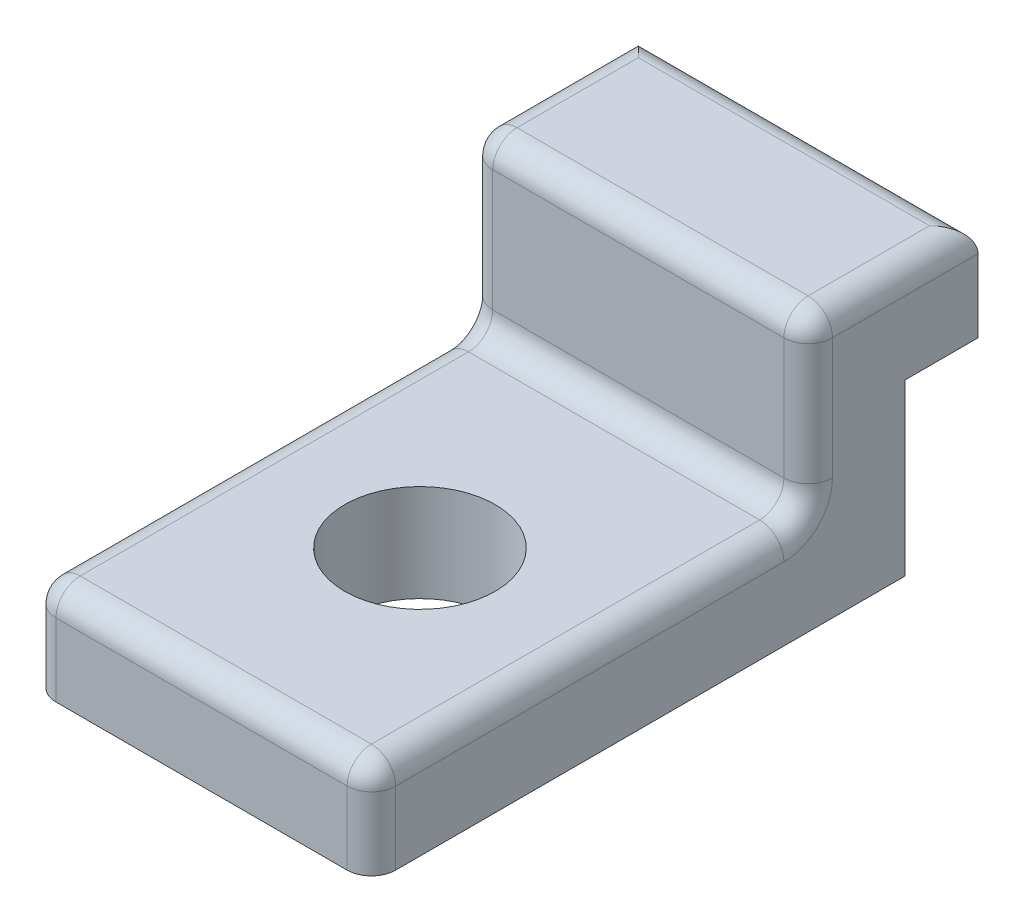
ISO-10303-21;
HEADER;
FILE_DESCRIPTION(('STEP AP214'),'2;1');
FILE_NAME('part.step','',(''),(''),'','','');
FILE_SCHEMA(('AUTOMOTIVE_DESIGN { 1 0 10303 214 1 1 1 1 }'));
ENDSEC;
DATA;
#1=APPLICATION_CONTEXT('core data for automotive mechanical design processes');
#2=APPLICATION_PROTOCOL_DEFINITION('international standard','automotive_design',2000,#1);
#3=PRODUCT_CONTEXT('',#1,'mechanical');
#4=PRODUCT('Part','Part','',(#3));
#5=PRODUCT_RELATED_PRODUCT_CATEGORY('part','',(#4));
#6=PRODUCT_DEFINITION_FORMATION('','',#4);
#7=PRODUCT_DEFINITION_CONTEXT('part definition',#1,'design');
#8=PRODUCT_DEFINITION('design','',#6,#7);
#9=PRODUCT_DEFINITION_SHAPE('','',#8);
#10=(LENGTH_UNIT() NAMED_UNIT(*) SI_UNIT(.MILLI.,.METRE.));
#11=(NAMED_UNIT(*) PLANE_ANGLE_UNIT() SI_UNIT($,.RADIAN.));
#12=(NAMED_UNIT(*) SI_UNIT($,.STERADIAN.) SOLID_ANGLE_UNIT());
#13=UNCERTAINTY_MEASURE_WITH_UNIT(LENGTH_MEASURE(1.E-05),#10,'distance_accuracy_value','');
#14=(GEOMETRIC_REPRESENTATION_CONTEXT(3) GLOBAL_UNCERTAINTY_ASSIGNED_CONTEXT((#13)) GLOBAL_UNIT_ASSIGNED_CONTEXT((#10,
#11,#12)) REPRESENTATION_CONTEXT('',''));
#15=CARTESIAN_POINT('',(0.,0.,0.));
#16=DIRECTION('',(0.,0.,1.));
#17=DIRECTION('',(1.,0.,0.));
#18=AXIS2_PLACEMENT_3D('',#15,#16,#17);
#19=CARTESIAN_POINT('',(-3.5,2.,-5.5));
#20=DIRECTION('',(0.,0.,1.));
#21=DIRECTION('',(1.,0.,0.));
#22=AXIS2_PLACEMENT_3D('',#19,#20,#21);
#23=PLANE('',#22);
#24=DIRECTION('',(-1.,0.,0.));
#25=VECTOR('',#24,1.);
#26=CARTESIAN_POINT('',(3.5,3.5,-5.5));
#27=LINE('',#26,#25);
#28=CARTESIAN_POINT('',(3.5,3.5,-5.5));
#29=VERTEX_POINT('',#28);
#30=CARTESIAN_POINT('',(-3.5,3.5,-5.5));
#31=VERTEX_POINT('',#30);
#32=EDGE_CURVE('E172',#29,#31,#27,.T.);
#33=ORIENTED_EDGE('',*,*,#32,.F.);
#34=DIRECTION('',(0.,-1.,0.));
#35=VECTOR('',#34,1.);
#36=CARTESIAN_POINT('',(3.5,2.,-5.5));
#37=LINE('',#36,#35);
#38=CARTESIAN_POINT('',(3.5,0.,-5.5));
#39=VERTEX_POINT('',#38);
#40=EDGE_CURVE('E187',#29,#39,#37,.T.);
#41=ORIENTED_EDGE('',*,*,#40,.T.);
#42=DIRECTION('',(-1.,0.,0.));
#43=VECTOR('',#42,1.);
#44=CARTESIAN_POINT('',(-3.5,0.,-5.5));
#45=LINE('',#44,#43);
#46=CARTESIAN_POINT('',(-3.5,0.,-5.5));
#47=VERTEX_POINT('',#46);
#48=EDGE_CURVE('E190',#39,#47,#45,.T.);
#49=ORIENTED_EDGE('',*,*,#48,.T.);
#50=DIRECTION('',(0.,-1.,0.));
#51=VECTOR('',#50,1.);
#52=CARTESIAN_POINT('',(-3.5,2.,-5.5));
#53=LINE('',#52,#51);
#54=EDGE_CURVE('E203',#31,#47,#53,.T.);
#55=ORIENTED_EDGE('',*,*,#54,.F.);
#56=EDGE_LOOP('',(#33,#41,#49,#55));
#57=FACE_BOUND('',#56,.T.);
#58=ADVANCED_FACE('F39',(#57),#23,.F.);
#59=CARTESIAN_POINT('',(3.5,2.,-5.5));
#60=DIRECTION('',(-1.,0.,0.));
#61=DIRECTION('',(0.,0.,1.));
#62=AXIS2_PLACEMENT_3D('',#59,#60,#61);
#63=PLANE('',#62);
#64=DIRECTION('',(0.,-1.,0.));
#65=VECTOR('',#64,1.);
#66=CARTESIAN_POINT('',(3.5,5.5,-7.));
#67=LINE('',#66,#65);
#68=CARTESIAN_POINT('',(3.5,5.,-7.));
#69=VERTEX_POINT('',#68);
#70=CARTESIAN_POINT('',(3.5,3.5,-7.));
#71=VERTEX_POINT('',#70);
#72=EDGE_CURVE('E161',#69,#71,#67,.T.);
#73=ORIENTED_EDGE('',*,*,#72,.F.);
#74=DIRECTION('',(0.,0.,-1.));
#75=VECTOR('',#74,1.);
#76=CARTESIAN_POINT('',(3.5,5.,-3.5));
#77=LINE('',#76,#75);
#78=CARTESIAN_POINT('',(3.5,5.,-4.));
#79=VERTEX_POINT('',#78);
#80=EDGE_CURVE('E235',#69,#79,#77,.F.);
#81=ORIENTED_EDGE('',*,*,#80,.T.);
#82=DIRECTION('',(0.,-1.,0.));
#83=VECTOR('',#82,1.);
#84=CARTESIAN_POINT('',(3.5,2.,-4.));
#85=LINE('',#84,#83);
#86=CARTESIAN_POINT('',(3.5,2.5,-4.));
#87=VERTEX_POINT('',#86);
#88=EDGE_CURVE('E233',#79,#87,#85,.T.);
#89=ORIENTED_EDGE('',*,*,#88,.T.);
#90=CARTESIAN_POINT('',(3.5,2.5,-3.));
#91=DIRECTION('',(-1.,0.,0.));
#92=DIRECTION('',(0.,0.,1.));
#93=AXIS2_PLACEMENT_3D('',#90,#91,#92);
#94=CIRCLE('',#93,1.);
#95=CARTESIAN_POINT('',(3.5,1.5,-3.));
#96=VERTEX_POINT('',#95);
#97=EDGE_CURVE('E230',#96,#87,#94,.F.);
#98=ORIENTED_EDGE('',*,*,#97,.F.);
#99=DIRECTION('',(0.,0.,-1.));
#100=VECTOR('',#99,1.);
#101=CARTESIAN_POINT('',(3.5,1.5,5.5));
#102=LINE('',#101,#100);
#103=CARTESIAN_POINT('',(3.5,1.5,5.));
#104=VERTEX_POINT('',#103);
#105=EDGE_CURVE('E226',#96,#104,#102,.F.);
#106=ORIENTED_EDGE('',*,*,#105,.T.);
#107=DIRECTION('',(0.,-1.,0.));
#108=VECTOR('',#107,1.);
#109=CARTESIAN_POINT('',(3.5,2.,5.));
#110=LINE('',#109,#108);
#111=CARTESIAN_POINT('',(3.5,0.,5.));
#112=VERTEX_POINT('',#111);
#113=EDGE_CURVE('E228',#104,#112,#110,.T.);
#114=ORIENTED_EDGE('',*,*,#113,.T.);
#115=DIRECTION('',(0.,0.,-1.));
#116=VECTOR('',#115,1.);
#117=CARTESIAN_POINT('',(3.5,0.,-5.5));
#118=LINE('',#117,#116);
#119=EDGE_CURVE('E188',#112,#39,#118,.T.);
#120=ORIENTED_EDGE('',*,*,#119,.T.);
#121=ORIENTED_EDGE('',*,*,#40,.F.);
#122=DIRECTION('',(0.,0.,1.));
#123=VECTOR('',#122,1.);
#124=CARTESIAN_POINT('',(3.5,3.5,-7.));
#125=LINE('',#124,#123);
#126=EDGE_CURVE('E178',#71,#29,#125,.T.);
#127=ORIENTED_EDGE('',*,*,#126,.F.);
#128=EDGE_LOOP('',(#73,#81,#89,#98,#106,#114,#120,#121,#127));
#129=FACE_BOUND('',#128,.T.);
#130=ADVANCED_FACE('F185',(#129),#63,.F.);
#131=CARTESIAN_POINT('',(-3.5,2.,-5.5));
#132=DIRECTION('',(1.,0.,0.));
#133=DIRECTION('',(0.,0.,-1.));
#134=AXIS2_PLACEMENT_3D('',#131,#132,#133);
#135=PLANE('',#134);
#136=DIRECTION('',(0.,-1.,0.));
#137=VECTOR('',#136,1.);
#138=CARTESIAN_POINT('',(-3.5,2.,-4.));
#139=LINE('',#138,#137);
#140=CARTESIAN_POINT('',(-3.5,2.5,-4.));
#141=VERTEX_POINT('',#140);
#142=CARTESIAN_POINT('',(-3.5,5.,-4.));
#143=VERTEX_POINT('',#142);
#144=EDGE_CURVE('E221',#141,#143,#139,.F.);
#145=ORIENTED_EDGE('',*,*,#144,.T.);
#146=DIRECTION('',(0.,0.,1.));
#147=VECTOR('',#146,1.);
#148=CARTESIAN_POINT('',(-3.5,5.,-7.));
#149=LINE('',#148,#147);
#150=CARTESIAN_POINT('',(-3.5,5.,-7.));
#151=VERTEX_POINT('',#150);
#152=EDGE_CURVE('E224',#143,#151,#149,.F.);
#153=ORIENTED_EDGE('',*,*,#152,.T.);
#154=DIRECTION('',(0.,1.,0.));
#155=VECTOR('',#154,1.);
#156=CARTESIAN_POINT('',(-3.5,5.5,-7.));
#157=LINE('',#156,#155);
#158=CARTESIAN_POINT('',(-3.5,3.5,-7.));
#159=VERTEX_POINT('',#158);
#160=EDGE_CURVE('E182',#159,#151,#157,.T.);
#161=ORIENTED_EDGE('',*,*,#160,.F.);
#162=DIRECTION('',(0.,0.,1.));
#163=VECTOR('',#162,1.);
#164=CARTESIAN_POINT('',(-3.5,3.5,-7.));
#165=LINE('',#164,#163);
#166=EDGE_CURVE('E180',#159,#31,#165,.T.);
#167=ORIENTED_EDGE('',*,*,#166,.T.);
#168=ORIENTED_EDGE('',*,*,#54,.T.);
#169=DIRECTION('',(0.,0.,1.));
#170=VECTOR('',#169,1.);
#171=CARTESIAN_POINT('',(-3.5,0.,-5.5));
#172=LINE('',#171,#170);
#173=CARTESIAN_POINT('',(-3.5,0.,5.));
#174=VERTEX_POINT('',#173);
#175=EDGE_CURVE('E197',#47,#174,#172,.T.);
#176=ORIENTED_EDGE('',*,*,#175,.T.);
#177=DIRECTION('',(0.,-1.,0.));
#178=VECTOR('',#177,1.);
#179=CARTESIAN_POINT('',(-3.5,2.,5.));
#180=LINE('',#179,#178);
#181=CARTESIAN_POINT('',(-3.5,1.5,5.));
#182=VERTEX_POINT('',#181);
#183=EDGE_CURVE('E219',#174,#182,#180,.F.);
#184=ORIENTED_EDGE('',*,*,#183,.T.);
#185=DIRECTION('',(0.,0.,1.));
#186=VECTOR('',#185,1.);
#187=CARTESIAN_POINT('',(-3.5,1.5,-3.5));
#188=LINE('',#187,#186);
#189=CARTESIAN_POINT('',(-3.5,1.5,-3.));
#190=VERTEX_POINT('',#189);
#191=EDGE_CURVE('E217',#182,#190,#188,.F.);
#192=ORIENTED_EDGE('',*,*,#191,.T.);
#193=CARTESIAN_POINT('',(-3.5,2.5,-3.));
#194=DIRECTION('',(1.,0.,0.));
#195=DIRECTION('',(0.,0.,-1.));
#196=AXIS2_PLACEMENT_3D('',#193,#194,#195);
#197=CIRCLE('',#196,1.);
#198=EDGE_CURVE('E215',#141,#190,#197,.F.);
#199=ORIENTED_EDGE('',*,*,#198,.F.);
#200=EDGE_LOOP('',(#145,#153,#161,#167,#168,#176,#184,#192,#199));
#201=FACE_BOUND('',#200,.T.);
#202=ADVANCED_FACE('F329',(#201),#135,.F.);
#203=CARTESIAN_POINT('',(-3.5,2.,5.5));
#204=DIRECTION('',(0.,0.,-1.));
#205=DIRECTION('',(-1.,0.,0.));
#206=AXIS2_PLACEMENT_3D('',#203,#204,#205);
#207=PLANE('',#206);
#208=DIRECTION('',(1.,0.,0.));
#209=VECTOR('',#208,1.);
#210=CARTESIAN_POINT('',(-3.5,0.,5.5));
#211=LINE('',#210,#209);
#212=CARTESIAN_POINT('',(-3.,0.,5.5));
#213=VERTEX_POINT('',#212);
#214=CARTESIAN_POINT('',(3.,0.,5.5));
#215=VERTEX_POINT('',#214);
#216=EDGE_CURVE('E200',#213,#215,#211,.T.);
#217=ORIENTED_EDGE('',*,*,#216,.T.);
#218=DIRECTION('',(0.,-1.,0.));
#219=VECTOR('',#218,1.);
#220=CARTESIAN_POINT('',(3.,2.,5.5));
#221=LINE('',#220,#219);
#222=CARTESIAN_POINT('',(3.,1.5,5.5));
#223=VERTEX_POINT('',#222);
#224=EDGE_CURVE('E245',#215,#223,#221,.F.);
#225=ORIENTED_EDGE('',*,*,#224,.T.);
#226=DIRECTION('',(1.,0.,0.));
#227=VECTOR('',#226,1.);
#228=CARTESIAN_POINT('',(-3.5,1.5,5.5));
#229=LINE('',#228,#227);
#230=CARTESIAN_POINT('',(-3.,1.5,5.5));
#231=VERTEX_POINT('',#230);
#232=EDGE_CURVE('E241',#223,#231,#229,.F.);
#233=ORIENTED_EDGE('',*,*,#232,.T.);
#234=DIRECTION('',(0.,-1.,0.));
#235=VECTOR('',#234,1.);
#236=CARTESIAN_POINT('',(-3.,2.,5.5));
#237=LINE('',#236,#235);
#238=EDGE_CURVE('E243',#231,#213,#237,.T.);
#239=ORIENTED_EDGE('',*,*,#238,.T.);
#240=EDGE_LOOP('',(#217,#225,#233,#239));
#241=FACE_BOUND('',#240,.T.);
#242=ADVANCED_FACE('F393',(#241),#207,.F.);
#243=CARTESIAN_POINT('',(0.,2.,0.));
#244=DIRECTION('',(0.,1.,0.));
#245=DIRECTION('',(0.,0.,1.));
#246=AXIS2_PLACEMENT_3D('',#243,#244,#245);
#247=PLANE('',#246);
#248=DIRECTION('',(0.,0.,-1.));
#249=VECTOR('',#248,1.);
#250=CARTESIAN_POINT('',(3.,2.,-3.5));
#251=LINE('',#250,#249);
#252=CARTESIAN_POINT('',(3.,2.,5.));
#253=VERTEX_POINT('',#252);
#254=CARTESIAN_POINT('',(3.,2.,-3.));
#255=VERTEX_POINT('',#254);
#256=EDGE_CURVE('E63',#253,#255,#251,.T.);
#257=ORIENTED_EDGE('',*,*,#256,.T.);
#258=DIRECTION('',(1.,0.,0.));
#259=VECTOR('',#258,1.);
#260=CARTESIAN_POINT('',(0.,2.,-3.));
#261=LINE('',#260,#259);
#262=CARTESIAN_POINT('',(-3.,2.,-3.));
#263=VERTEX_POINT('',#262);
#264=EDGE_CURVE('E11',#255,#263,#261,.F.);
#265=ORIENTED_EDGE('',*,*,#264,.T.);
#266=DIRECTION('',(0.,0.,1.));
#267=VECTOR('',#266,1.);
#268=CARTESIAN_POINT('',(-3.,2.,5.5));
#269=LINE('',#268,#267);
#270=CARTESIAN_POINT('',(-3.,2.,5.));
#271=VERTEX_POINT('',#270);
#272=EDGE_CURVE('E48',#263,#271,#269,.T.);
#273=ORIENTED_EDGE('',*,*,#272,.T.);
#274=DIRECTION('',(1.,0.,0.));
#275=VECTOR('',#274,1.);
#276=CARTESIAN_POINT('',(3.5,2.,5.));
#277=LINE('',#276,#275);
#278=EDGE_CURVE('E257',#271,#253,#277,.T.);
#279=ORIENTED_EDGE('',*,*,#278,.T.);
#280=EDGE_LOOP('',(#257,#265,#273,#279));
#281=FACE_BOUND('',#280,.T.);
#282=CARTESIAN_POINT('',(0.,2.,1.));
#283=DIRECTION('',(0.,1.,0.));
#284=DIRECTION('',(0.,0.,1.));
#285=AXIS2_PLACEMENT_3D('',#282,#283,#284);
#286=CIRCLE('',#285,1.55);
#287=CARTESIAN_POINT('',(0.,2.,2.55));
#288=VERTEX_POINT('',#287);
#289=EDGE_CURVE('E315',#288,#288,#286,.T.);
#290=ORIENTED_EDGE('',*,*,#289,.F.);
#291=EDGE_LOOP('',(#290));
#292=FACE_BOUND('',#291,.T.);
#293=ADVANCED_FACE('F370',(#281,#292),#247,.T.);
#294=CARTESIAN_POINT('',(0.,0.,0.));
#295=DIRECTION('',(0.,1.,0.));
#296=DIRECTION('',(0.,0.,1.));
#297=AXIS2_PLACEMENT_3D('',#294,#295,#296);
#298=PLANE('',#297);
#299=CARTESIAN_POINT('',(0.,0.,1.));
#300=DIRECTION('',(0.,1.,0.));
#301=DIRECTION('',(0.,0.,1.));
#302=AXIS2_PLACEMENT_3D('',#299,#300,#301);
#303=CIRCLE('',#302,1.55);
#304=CARTESIAN_POINT('',(0.,0.,2.55));
#305=VERTEX_POINT('',#304);
#306=EDGE_CURVE('E320',#305,#305,#303,.T.);
#307=ORIENTED_EDGE('',*,*,#306,.T.);
#308=EDGE_LOOP('',(#307));
#309=FACE_BOUND('',#308,.T.);
#310=ORIENTED_EDGE('',*,*,#119,.F.);
#311=CARTESIAN_POINT('',(3.,0.,5.));
#312=DIRECTION('',(0.,1.,0.));
#313=DIRECTION('',(0.,0.,1.));
#314=AXIS2_PLACEMENT_3D('',#311,#312,#313);
#315=CIRCLE('',#314,0.5);
#316=EDGE_CURVE('E239',#112,#215,#315,.F.);
#317=ORIENTED_EDGE('',*,*,#316,.T.);
#318=ORIENTED_EDGE('',*,*,#216,.F.);
#319=CARTESIAN_POINT('',(-3.,0.,5.));
#320=DIRECTION('',(0.,1.,0.));
#321=DIRECTION('',(0.,0.,1.));
#322=AXIS2_PLACEMENT_3D('',#319,#320,#321);
#323=CIRCLE('',#322,0.5);
#324=EDGE_CURVE('E237',#213,#174,#323,.F.);
#325=ORIENTED_EDGE('',*,*,#324,.T.);
#326=ORIENTED_EDGE('',*,*,#175,.F.);
#327=ORIENTED_EDGE('',*,*,#48,.F.);
#328=EDGE_LOOP('',(#310,#317,#318,#325,#326,#327));
#329=FACE_BOUND('',#328,.T.);
#330=ADVANCED_FACE('F397',(#309,#329),#298,.F.);
#331=CARTESIAN_POINT('',(-3.5,5.5,-3.5));
#332=DIRECTION('',(0.,0.,-1.));
#333=DIRECTION('',(-1.,0.,0.));
#334=AXIS2_PLACEMENT_3D('',#331,#332,#333);
#335=PLANE('',#334);
#336=DIRECTION('',(0.,-1.,0.));
#337=VECTOR('',#336,1.);
#338=CARTESIAN_POINT('',(3.,5.5,-3.5));
#339=LINE('',#338,#337);
#340=CARTESIAN_POINT('',(3.,2.5,-3.5));
#341=VERTEX_POINT('',#340);
#342=CARTESIAN_POINT('',(3.,5.,-3.5));
#343=VERTEX_POINT('',#342);
#344=EDGE_CURVE('E208',#341,#343,#339,.F.);
#345=ORIENTED_EDGE('',*,*,#344,.T.);
#346=DIRECTION('',(1.,0.,0.));
#347=VECTOR('',#346,1.);
#348=CARTESIAN_POINT('',(-3.5,5.,-3.5));
#349=LINE('',#348,#347);
#350=CARTESIAN_POINT('',(-3.,5.,-3.5));
#351=VERTEX_POINT('',#350);
#352=EDGE_CURVE('E213',#343,#351,#349,.F.);
#353=ORIENTED_EDGE('',*,*,#352,.T.);
#354=DIRECTION('',(0.,-1.,0.));
#355=VECTOR('',#354,1.);
#356=CARTESIAN_POINT('',(-3.,5.5,-3.5));
#357=LINE('',#356,#355);
#358=CARTESIAN_POINT('',(-3.,2.5,-3.5));
#359=VERTEX_POINT('',#358);
#360=EDGE_CURVE('E210',#351,#359,#357,.T.);
#361=ORIENTED_EDGE('',*,*,#360,.T.);
#362=DIRECTION('',(1.,0.,0.));
#363=VECTOR('',#362,1.);
#364=CARTESIAN_POINT('',(-3.5,2.5,-3.5));
#365=LINE('',#364,#363);
#366=EDGE_CURVE('E206',#359,#341,#365,.T.);
#367=ORIENTED_EDGE('',*,*,#366,.T.);
#368=EDGE_LOOP('',(#345,#353,#361,#367));
#369=FACE_BOUND('',#368,.T.);
#370=ADVANCED_FACE('F591',(#369),#335,.F.);
#371=CARTESIAN_POINT('',(0.,5.5,0.));
#372=DIRECTION('',(0.,1.,0.));
#373=DIRECTION('',(0.,0.,1.));
#374=AXIS2_PLACEMENT_3D('',#371,#372,#373);
#375=PLANE('',#374);
#376=DIRECTION('',(0.,0.,-1.));
#377=VECTOR('',#376,1.);
#378=CARTESIAN_POINT('',(3.,5.5,-7.));
#379=LINE('',#378,#377);
#380=CARTESIAN_POINT('',(3.,5.5,-4.));
#381=VERTEX_POINT('',#380);
#382=CARTESIAN_POINT('',(3.,5.5,-6.5));
#383=VERTEX_POINT('',#382);
#384=EDGE_CURVE('E252',#381,#383,#379,.T.);
#385=ORIENTED_EDGE('',*,*,#384,.T.);
#386=DIRECTION('',(1.,0.,0.));
#387=VECTOR('',#386,1.);
#388=CARTESIAN_POINT('',(0.,5.5,-6.5));
#389=LINE('',#388,#387);
#390=CARTESIAN_POINT('',(-3.,5.5,-6.5));
#391=VERTEX_POINT('',#390);
#392=EDGE_CURVE('E254',#383,#391,#389,.F.);
#393=ORIENTED_EDGE('',*,*,#392,.T.);
#394=DIRECTION('',(0.,0.,1.));
#395=VECTOR('',#394,1.);
#396=CARTESIAN_POINT('',(-3.,5.5,-3.5));
#397=LINE('',#396,#395);
#398=CARTESIAN_POINT('',(-3.,5.5,-4.));
#399=VERTEX_POINT('',#398);
#400=EDGE_CURVE('E250',#391,#399,#397,.T.);
#401=ORIENTED_EDGE('',*,*,#400,.T.);
#402=DIRECTION('',(1.,0.,0.));
#403=VECTOR('',#402,1.);
#404=CARTESIAN_POINT('',(3.5,5.5,-4.));
#405=LINE('',#404,#403);
#406=EDGE_CURVE('E248',#399,#381,#405,.T.);
#407=ORIENTED_EDGE('',*,*,#406,.T.);
#408=EDGE_LOOP('',(#385,#393,#401,#407));
#409=FACE_BOUND('',#408,.T.);
#410=ADVANCED_FACE('F341',(#409),#375,.T.);
#411=CARTESIAN_POINT('',(3.5,3.5,-7.));
#412=DIRECTION('',(0.,1.,0.));
#413=DIRECTION('',(0.,0.,1.));
#414=AXIS2_PLACEMENT_3D('',#411,#412,#413);
#415=PLANE('',#414);
#416=ORIENTED_EDGE('',*,*,#32,.T.);
#417=ORIENTED_EDGE('',*,*,#166,.F.);
#418=DIRECTION('',(-1.,0.,0.));
#419=VECTOR('',#418,1.);
#420=CARTESIAN_POINT('',(3.5,3.5,-7.));
#421=LINE('',#420,#419);
#422=EDGE_CURVE('E165',#71,#159,#421,.T.);
#423=ORIENTED_EDGE('',*,*,#422,.F.);
#424=ORIENTED_EDGE('',*,*,#126,.T.);
#425=EDGE_LOOP('',(#416,#417,#423,#424));
#426=FACE_BOUND('',#425,.T.);
#427=ADVANCED_FACE('F177',(#426),#415,.F.);
#428=CARTESIAN_POINT('',(0.,0.,-7.));
#429=DIRECTION('',(0.,0.,-1.));
#430=DIRECTION('',(-1.,0.,0.));
#431=AXIS2_PLACEMENT_3D('',#428,#429,#430);
#432=PLANE('',#431);
#433=ORIENTED_EDGE('',*,*,#160,.T.);
#434=DIRECTION('',(1.,0.,0.));
#435=VECTOR('',#434,1.);
#436=CARTESIAN_POINT('',(0.,5.,-7.));
#437=LINE('',#436,#435);
#438=EDGE_CURVE('E168',#151,#69,#437,.T.);
#439=ORIENTED_EDGE('',*,*,#438,.T.);
#440=ORIENTED_EDGE('',*,*,#72,.T.);
#441=ORIENTED_EDGE('',*,*,#422,.T.);
#442=EDGE_LOOP('',(#433,#439,#440,#441));
#443=FACE_BOUND('',#442,.T.);
#444=ADVANCED_FACE('F164',(#443),#432,.T.);
#445=CARTESIAN_POINT('',(0.,0.,1.));
#446=DIRECTION('',(0.,1.,0.));
#447=DIRECTION('',(0.,0.,1.));
#448=AXIS2_PLACEMENT_3D('',#445,#446,#447);
#449=CYLINDRICAL_SURFACE('',#448,1.55);
#450=ORIENTED_EDGE('',*,*,#306,.F.);
#451=EDGE_LOOP('',(#450));
#452=FACE_BOUND('',#451,.T.);
#453=ORIENTED_EDGE('',*,*,#289,.T.);
#454=EDGE_LOOP('',(#453));
#455=FACE_BOUND('',#454,.T.);
#456=ADVANCED_FACE('F408',(#452,#455),#449,.F.);
#457=CARTESIAN_POINT('',(3.,2.,5.));
#458=DIRECTION('',(0.,-1.,0.));
#459=DIRECTION('',(0.,0.,-1.));
#460=AXIS2_PLACEMENT_3D('',#457,#458,#459);
#461=CYLINDRICAL_SURFACE('',#460,0.5);
#462=CARTESIAN_POINT('',(3.,1.5,5.));
#463=DIRECTION('',(0.,1.,0.));
#464=DIRECTION('',(0.,0.,1.));
#465=AXIS2_PLACEMENT_3D('',#462,#463,#464);
#466=CIRCLE('',#465,0.5);
#467=EDGE_CURVE('E43',#223,#104,#466,.T.);
#468=ORIENTED_EDGE('',*,*,#467,.F.);
#469=ORIENTED_EDGE('',*,*,#224,.F.);
#470=ORIENTED_EDGE('',*,*,#316,.F.);
#471=ORIENTED_EDGE('',*,*,#113,.F.);
#472=EDGE_LOOP('',(#468,#469,#470,#471));
#473=FACE_BOUND('',#472,.T.);
#474=ADVANCED_FACE('F41',(#473),#461,.T.);
#475=CARTESIAN_POINT('',(3.,1.5,5.));
#476=DIRECTION('',(1.,0.,0.));
#477=DIRECTION('',(0.,0.,-1.));
#478=AXIS2_PLACEMENT_3D('',#475,#476,#477);
#479=SPHERICAL_SURFACE('',#478,0.5);
#480=CARTESIAN_POINT('',(3.,1.5,5.));
#481=DIRECTION('',(1.,0.,0.));
#482=DIRECTION('',(0.,0.,-1.));
#483=AXIS2_PLACEMENT_3D('',#480,#481,#482);
#484=CIRCLE('',#483,0.5);
#485=EDGE_CURVE('E307',#223,#253,#484,.F.);
#486=ORIENTED_EDGE('',*,*,#485,.F.);
#487=ORIENTED_EDGE('',*,*,#467,.T.);
#488=CARTESIAN_POINT('',(3.,1.5,5.));
#489=DIRECTION('',(0.,0.,1.));
#490=DIRECTION('',(0.,-1.,0.));
#491=AXIS2_PLACEMENT_3D('',#488,#489,#490);
#492=CIRCLE('',#491,0.5);
#493=EDGE_CURVE('E309',#253,#104,#492,.F.);
#494=ORIENTED_EDGE('',*,*,#493,.F.);
#495=EDGE_LOOP('',(#486,#487,#494));
#496=FACE_BOUND('',#495,.T.);
#497=ADVANCED_FACE('F401',(#496),#479,.T.);
#498=CARTESIAN_POINT('',(3.,5.,0.));
#499=DIRECTION('',(0.,0.,1.));
#500=DIRECTION('',(1.,0.,0.));
#501=AXIS2_PLACEMENT_3D('',#498,#499,#500);
#502=CYLINDRICAL_SURFACE('',#501,0.5);
#503=CARTESIAN_POINT('',(3.,5.,-4.));
#504=DIRECTION('',(0.,0.,1.));
#505=DIRECTION('',(1.,0.,0.));
#506=AXIS2_PLACEMENT_3D('',#503,#504,#505);
#507=CIRCLE('',#506,0.5);
#508=EDGE_CURVE('E301',#79,#381,#507,.T.);
#509=ORIENTED_EDGE('',*,*,#508,.F.);
#510=ORIENTED_EDGE('',*,*,#80,.F.);
#511=CARTESIAN_POINT('',(3.,5.,-6.5));
#512=DIRECTION('',(0.707106781186547,0.,0.707106781186548));
#513=DIRECTION('',(-0.707106781186547,0.,0.707106781186547));
#514=AXIS2_PLACEMENT_3D('',#511,#512,#513);
#515=ELLIPSE('',#514,0.707106781186547,0.5);
#516=EDGE_CURVE('E304',#383,#69,#515,.F.);
#517=ORIENTED_EDGE('',*,*,#516,.F.);
#518=ORIENTED_EDGE('',*,*,#384,.F.);
#519=EDGE_LOOP('',(#509,#510,#517,#518));
#520=FACE_BOUND('',#519,.T.);
#521=ADVANCED_FACE('F354',(#520),#502,.T.);
#522=CARTESIAN_POINT('',(3.,2.,-4.));
#523=DIRECTION('',(0.,-1.,0.));
#524=DIRECTION('',(0.,0.,-1.));
#525=AXIS2_PLACEMENT_3D('',#522,#523,#524);
#526=CYLINDRICAL_SURFACE('',#525,0.5);
#527=CARTESIAN_POINT('',(3.,2.5,-4.));
#528=DIRECTION('',(0.,-1.,0.));
#529=DIRECTION('',(0.,0.,-1.));
#530=AXIS2_PLACEMENT_3D('',#527,#528,#529);
#531=CIRCLE('',#530,0.5);
#532=EDGE_CURVE('E295',#87,#341,#531,.T.);
#533=ORIENTED_EDGE('',*,*,#532,.F.);
#534=ORIENTED_EDGE('',*,*,#88,.F.);
#535=CARTESIAN_POINT('',(3.,5.,-4.));
#536=DIRECTION('',(0.,1.,0.));
#537=DIRECTION('',(0.,0.,1.));
#538=AXIS2_PLACEMENT_3D('',#535,#536,#537);
#539=CIRCLE('',#538,0.5);
#540=EDGE_CURVE('E298',#343,#79,#539,.T.);
#541=ORIENTED_EDGE('',*,*,#540,.F.);
#542=ORIENTED_EDGE('',*,*,#344,.F.);
#543=EDGE_LOOP('',(#533,#534,#541,#542));
#544=FACE_BOUND('',#543,.T.);
#545=ADVANCED_FACE('F358',(#544),#526,.T.);
#546=CARTESIAN_POINT('',(3.,1.5,0.));
#547=DIRECTION('',(0.,0.,1.));
#548=DIRECTION('',(1.,0.,0.));
#549=AXIS2_PLACEMENT_3D('',#546,#547,#548);
#550=CYLINDRICAL_SURFACE('',#549,0.5);
#551=ORIENTED_EDGE('',*,*,#493,.T.);
#552=ORIENTED_EDGE('',*,*,#105,.F.);
#553=CARTESIAN_POINT('',(3.,1.5,-3.));
#554=DIRECTION('',(0.,0.,-1.));
#555=DIRECTION('',(-1.,0.,0.));
#556=AXIS2_PLACEMENT_3D('',#553,#554,#555);
#557=CIRCLE('',#556,0.5);
#558=EDGE_CURVE('E292',#255,#96,#557,.T.);
#559=ORIENTED_EDGE('',*,*,#558,.F.);
#560=ORIENTED_EDGE('',*,*,#256,.F.);
#561=EDGE_LOOP('',(#551,#552,#559,#560));
#562=FACE_BOUND('',#561,.T.);
#563=ADVANCED_FACE('F364',(#562),#550,.T.);
#564=CARTESIAN_POINT('',(0.,1.5,5.));
#565=DIRECTION('',(-1.,0.,0.));
#566=DIRECTION('',(0.,0.,1.));
#567=AXIS2_PLACEMENT_3D('',#564,#565,#566);
#568=CYLINDRICAL_SURFACE('',#567,0.5);
#569=ORIENTED_EDGE('',*,*,#485,.T.);
#570=ORIENTED_EDGE('',*,*,#278,.F.);
#571=CARTESIAN_POINT('',(-3.,1.5,5.));
#572=DIRECTION('',(-1.,0.,0.));
#573=DIRECTION('',(0.,-1.,0.));
#574=AXIS2_PLACEMENT_3D('',#571,#572,#573);
#575=CIRCLE('',#574,0.5);
#576=EDGE_CURVE('E289',#231,#271,#575,.T.);
#577=ORIENTED_EDGE('',*,*,#576,.F.);
#578=ORIENTED_EDGE('',*,*,#232,.F.);
#579=EDGE_LOOP('',(#569,#570,#577,#578));
#580=FACE_BOUND('',#579,.T.);
#581=ADVANCED_FACE('F376',(#580),#568,.T.);
#582=CARTESIAN_POINT('',(-3.,2.,5.));
#583=DIRECTION('',(0.,-1.,0.));
#584=DIRECTION('',(0.,0.,-1.));
#585=AXIS2_PLACEMENT_3D('',#582,#583,#584);
#586=CYLINDRICAL_SURFACE('',#585,0.5);
#587=ORIENTED_EDGE('',*,*,#324,.F.);
#588=ORIENTED_EDGE('',*,*,#238,.F.);
#589=CARTESIAN_POINT('',(-3.,1.5,5.));
#590=DIRECTION('',(0.,1.,0.));
#591=DIRECTION('',(0.,0.,1.));
#592=AXIS2_PLACEMENT_3D('',#589,#590,#591);
#593=CIRCLE('',#592,0.5);
#594=EDGE_CURVE('E286',#182,#231,#593,.T.);
#595=ORIENTED_EDGE('',*,*,#594,.F.);
#596=ORIENTED_EDGE('',*,*,#183,.F.);
#597=EDGE_LOOP('',(#587,#588,#595,#596));
#598=FACE_BOUND('',#597,.T.);
#599=ADVANCED_FACE('F390',(#598),#586,.T.);
#600=CARTESIAN_POINT('',(0.,5.,-6.5));
#601=DIRECTION('',(1.,0.,0.));
#602=DIRECTION('',(0.,0.,-1.));
#603=AXIS2_PLACEMENT_3D('',#600,#601,#602);
#604=CYLINDRICAL_SURFACE('',#603,0.5);
#605=ORIENTED_EDGE('',*,*,#516,.T.);
#606=ORIENTED_EDGE('',*,*,#438,.F.);
#607=CARTESIAN_POINT('',(-3.,5.,-6.5));
#608=DIRECTION('',(0.707106781186547,0.,-0.707106781186547));
#609=DIRECTION('',(-0.707106781186547,0.,-0.707106781186547));
#610=AXIS2_PLACEMENT_3D('',#607,#608,#609);
#611=ELLIPSE('',#610,0.707106781186548,0.5);
#612=EDGE_CURVE('E283',#391,#151,#611,.F.);
#613=ORIENTED_EDGE('',*,*,#612,.F.);
#614=ORIENTED_EDGE('',*,*,#392,.F.);
#615=EDGE_LOOP('',(#605,#606,#613,#614));
#616=FACE_BOUND('',#615,.T.);
#617=ADVANCED_FACE('F333',(#616),#604,.T.);
#618=CARTESIAN_POINT('',(3.,5.,-4.));
#619=DIRECTION('',(1.,0.,0.));
#620=DIRECTION('',(0.,0.,-1.));
#621=AXIS2_PLACEMENT_3D('',#618,#619,#620);
#622=SPHERICAL_SURFACE('',#621,0.5);
#623=ORIENTED_EDGE('',*,*,#540,.T.);
#624=ORIENTED_EDGE('',*,*,#508,.T.);
#625=CARTESIAN_POINT('',(3.,5.,-4.));
#626=DIRECTION('',(1.,0.,0.));
#627=DIRECTION('',(0.,0.,-1.));
#628=AXIS2_PLACEMENT_3D('',#625,#626,#627);
#629=CIRCLE('',#628,0.5);
#630=EDGE_CURVE('E280',#343,#381,#629,.F.);
#631=ORIENTED_EDGE('',*,*,#630,.F.);
#632=EDGE_LOOP('',(#623,#624,#631));
#633=FACE_BOUND('',#632,.T.);
#634=ADVANCED_FACE('F350',(#633),#622,.T.);
#635=CARTESIAN_POINT('',(3.,2.5,-3.));
#636=DIRECTION('',(-1.,0.,0.));
#637=DIRECTION('',(0.,0.,1.));
#638=AXIS2_PLACEMENT_3D('',#635,#636,#637);
#639=TOROIDAL_SURFACE('',#638,1.,0.5);
#640=ORIENTED_EDGE('',*,*,#97,.T.);
#641=ORIENTED_EDGE('',*,*,#532,.T.);
#642=CARTESIAN_POINT('',(3.,2.5,-3.));
#643=DIRECTION('',(-1.,0.,0.));
#644=DIRECTION('',(0.,0.,1.));
#645=AXIS2_PLACEMENT_3D('',#642,#643,#644);
#646=CIRCLE('',#645,0.5);
#647=EDGE_CURVE('E277',#255,#341,#646,.F.);
#648=ORIENTED_EDGE('',*,*,#647,.F.);
#649=ORIENTED_EDGE('',*,*,#558,.T.);
#650=EDGE_LOOP('',(#640,#641,#648,#649));
#651=FACE_BOUND('',#650,.T.);
#652=ADVANCED_FACE('F362',(#651),#639,.T.);
#653=CARTESIAN_POINT('',(-3.,1.5,5.));
#654=DIRECTION('',(0.,0.,1.));
#655=DIRECTION('',(1.,0.,0.));
#656=AXIS2_PLACEMENT_3D('',#653,#654,#655);
#657=SPHERICAL_SURFACE('',#656,0.5);
#658=ORIENTED_EDGE('',*,*,#594,.T.);
#659=ORIENTED_EDGE('',*,*,#576,.T.);
#660=CARTESIAN_POINT('',(-3.,1.5,5.));
#661=DIRECTION('',(0.,0.,1.));
#662=DIRECTION('',(1.,0.,0.));
#663=AXIS2_PLACEMENT_3D('',#660,#661,#662);
#664=CIRCLE('',#663,0.5);
#665=EDGE_CURVE('E274',#182,#271,#664,.F.);
#666=ORIENTED_EDGE('',*,*,#665,.F.);
#667=EDGE_LOOP('',(#658,#659,#666));
#668=FACE_BOUND('',#667,.T.);
#669=ADVANCED_FACE('F380',(#668),#657,.T.);
#670=CARTESIAN_POINT('',(-3.,5.,0.));
#671=DIRECTION('',(0.,0.,-1.));
#672=DIRECTION('',(-1.,0.,0.));
#673=AXIS2_PLACEMENT_3D('',#670,#671,#672);
#674=CYLINDRICAL_SURFACE('',#673,0.5);
#675=ORIENTED_EDGE('',*,*,#612,.T.);
#676=ORIENTED_EDGE('',*,*,#152,.F.);
#677=CARTESIAN_POINT('',(-3.,5.,-4.));
#678=DIRECTION('',(0.,0.,1.));
#679=DIRECTION('',(1.,0.,0.));
#680=AXIS2_PLACEMENT_3D('',#677,#678,#679);
#681=CIRCLE('',#680,0.5);
#682=EDGE_CURVE('E271',#399,#143,#681,.T.);
#683=ORIENTED_EDGE('',*,*,#682,.F.);
#684=ORIENTED_EDGE('',*,*,#400,.F.);
#685=EDGE_LOOP('',(#675,#676,#683,#684));
#686=FACE_BOUND('',#685,.T.);
#687=ADVANCED_FACE('F337',(#686),#674,.T.);
#688=CARTESIAN_POINT('',(0.,5.,-4.));
#689=DIRECTION('',(-1.,0.,0.));
#690=DIRECTION('',(0.,0.,1.));
#691=AXIS2_PLACEMENT_3D('',#688,#689,#690);
#692=CYLINDRICAL_SURFACE('',#691,0.5);
#693=ORIENTED_EDGE('',*,*,#630,.T.);
#694=ORIENTED_EDGE('',*,*,#406,.F.);
#695=CARTESIAN_POINT('',(-3.,5.,-4.));
#696=DIRECTION('',(-1.,0.,0.));
#697=DIRECTION('',(0.,-1.,0.));
#698=AXIS2_PLACEMENT_3D('',#695,#696,#697);
#699=CIRCLE('',#698,0.5);
#700=EDGE_CURVE('E268',#351,#399,#699,.T.);
#701=ORIENTED_EDGE('',*,*,#700,.F.);
#702=ORIENTED_EDGE('',*,*,#352,.F.);
#703=EDGE_LOOP('',(#693,#694,#701,#702));
#704=FACE_BOUND('',#703,.T.);
#705=ADVANCED_FACE('F345',(#704),#692,.T.);
#706=CARTESIAN_POINT('',(-3.5,2.5,-3.));
#707=DIRECTION('',(1.,0.,0.));
#708=DIRECTION('',(0.,0.,-1.));
#709=AXIS2_PLACEMENT_3D('',#706,#707,#708);
#710=CYLINDRICAL_SURFACE('',#709,0.5);
#711=ORIENTED_EDGE('',*,*,#647,.T.);
#712=ORIENTED_EDGE('',*,*,#366,.F.);
#713=CARTESIAN_POINT('',(-3.,2.5,-3.));
#714=DIRECTION('',(1.,0.,0.));
#715=DIRECTION('',(0.,0.,-1.));
#716=AXIS2_PLACEMENT_3D('',#713,#714,#715);
#717=CIRCLE('',#716,0.5);
#718=EDGE_CURVE('E266',#263,#359,#717,.T.);
#719=ORIENTED_EDGE('',*,*,#718,.F.);
#720=ORIENTED_EDGE('',*,*,#264,.F.);
#721=EDGE_LOOP('',(#711,#712,#719,#720));
#722=FACE_BOUND('',#721,.T.);
#723=ADVANCED_FACE('F368',(#722),#710,.F.);
#724=CARTESIAN_POINT('',(-3.,1.5,0.));
#725=DIRECTION('',(0.,0.,-1.));
#726=DIRECTION('',(-1.,0.,0.));
#727=AXIS2_PLACEMENT_3D('',#724,#725,#726);
#728=CYLINDRICAL_SURFACE('',#727,0.5);
#729=ORIENTED_EDGE('',*,*,#665,.T.);
#730=ORIENTED_EDGE('',*,*,#272,.F.);
#731=CARTESIAN_POINT('',(-3.,1.5,-3.));
#732=DIRECTION('',(0.,0.,-1.));
#733=DIRECTION('',(-1.,0.,0.));
#734=AXIS2_PLACEMENT_3D('',#731,#732,#733);
#735=CIRCLE('',#734,0.5);
#736=EDGE_CURVE('E56',#190,#263,#735,.T.);
#737=ORIENTED_EDGE('',*,*,#736,.F.);
#738=ORIENTED_EDGE('',*,*,#191,.F.);
#739=EDGE_LOOP('',(#729,#730,#737,#738));
#740=FACE_BOUND('',#739,.T.);
#741=ADVANCED_FACE('F383',(#740),#728,.T.);
#742=CARTESIAN_POINT('',(-3.,5.,-4.));
#743=DIRECTION('',(0.,1.,0.));
#744=DIRECTION('',(-1.,0.,0.));
#745=AXIS2_PLACEMENT_3D('',#742,#743,#744);
#746=SPHERICAL_SURFACE('',#745,0.5);
#747=ORIENTED_EDGE('',*,*,#700,.T.);
#748=ORIENTED_EDGE('',*,*,#682,.T.);
#749=CARTESIAN_POINT('',(-3.,5.,-4.));
#750=DIRECTION('',(0.,1.,0.));
#751=DIRECTION('',(0.,0.,1.));
#752=AXIS2_PLACEMENT_3D('',#749,#750,#751);
#753=CIRCLE('',#752,0.5);
#754=EDGE_CURVE('E263',#351,#143,#753,.F.);
#755=ORIENTED_EDGE('',*,*,#754,.F.);
#756=EDGE_LOOP('',(#747,#748,#755));
#757=FACE_BOUND('',#756,.T.);
#758=ADVANCED_FACE('F426',(#757),#746,.T.);
#759=CARTESIAN_POINT('',(-3.,2.5,-3.));
#760=DIRECTION('',(1.,0.,0.));
#761=DIRECTION('',(0.,0.,-1.));
#762=AXIS2_PLACEMENT_3D('',#759,#760,#761);
#763=TOROIDAL_SURFACE('',#762,1.,0.5);
#764=ORIENTED_EDGE('',*,*,#736,.T.);
#765=ORIENTED_EDGE('',*,*,#718,.T.);
#766=CARTESIAN_POINT('',(-3.,2.5,-4.));
#767=DIRECTION('',(0.,-1.,0.));
#768=DIRECTION('',(0.,0.,-1.));
#769=AXIS2_PLACEMENT_3D('',#766,#767,#768);
#770=CIRCLE('',#769,0.5);
#771=EDGE_CURVE('E261',#141,#359,#770,.F.);
#772=ORIENTED_EDGE('',*,*,#771,.F.);
#773=ORIENTED_EDGE('',*,*,#198,.T.);
#774=EDGE_LOOP('',(#764,#765,#772,#773));
#775=FACE_BOUND('',#774,.T.);
#776=ADVANCED_FACE('F422',(#775),#763,.T.);
#777=CARTESIAN_POINT('',(-3.,5.5,-4.));
#778=DIRECTION('',(0.,-1.,0.));
#779=DIRECTION('',(0.,0.,-1.));
#780=AXIS2_PLACEMENT_3D('',#777,#778,#779);
#781=CYLINDRICAL_SURFACE('',#780,0.5);
#782=ORIENTED_EDGE('',*,*,#754,.T.);
#783=ORIENTED_EDGE('',*,*,#144,.F.);
#784=ORIENTED_EDGE('',*,*,#771,.T.);
#785=ORIENTED_EDGE('',*,*,#360,.F.);
#786=EDGE_LOOP('',(#782,#783,#784,#785));
#787=FACE_BOUND('',#786,.T.);
#788=ADVANCED_FACE('F419',(#787),#781,.T.);
#789=CLOSED_SHELL('',(#58,#130,#202,#242,#293,#330,#370,#410,#427,#444,#456,#474,#497,#521,#545,
#563,#581,#599,#617,#634,#652,#669,#687,#705,#723,#741,#758,#776,#788));
#790=MANIFOLD_SOLID_BREP('B2',#789);
#791=ADVANCED_BREP_SHAPE_REPRESENTATION('',(#18,#790),#14);
#792=SHAPE_DEFINITION_REPRESENTATION(#9,#791);
ENDSEC;
END-ISO-10303-21;
